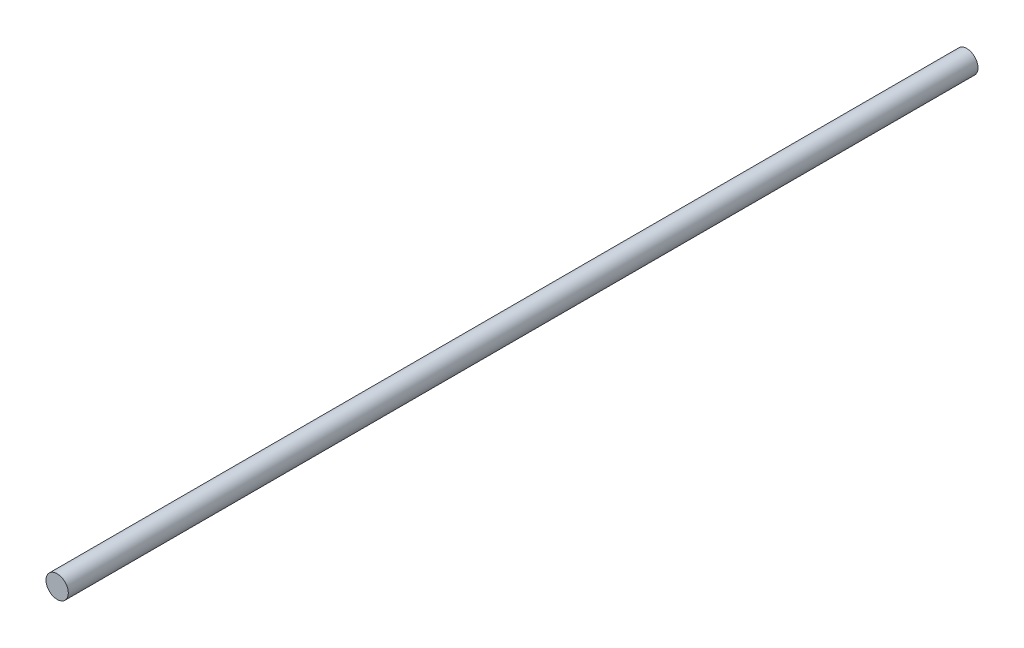
ISO-10303-21;
HEADER;
FILE_DESCRIPTION(('STEP AP214'),'2;1');
FILE_NAME('part.step','',(''),(''),'','','');
FILE_SCHEMA(('AUTOMOTIVE_DESIGN { 1 0 10303 214 1 1 1 1 }'));
ENDSEC;
DATA;
#1=APPLICATION_CONTEXT('core data for automotive mechanical design processes');
#2=APPLICATION_PROTOCOL_DEFINITION('international standard','automotive_design',2000,#1);
#3=PRODUCT_CONTEXT('',#1,'mechanical');
#4=PRODUCT('Part','Part','',(#3));
#5=PRODUCT_RELATED_PRODUCT_CATEGORY('part','',(#4));
#6=PRODUCT_DEFINITION_FORMATION('','',#4);
#7=PRODUCT_DEFINITION_CONTEXT('part definition',#1,'design');
#8=PRODUCT_DEFINITION('design','',#6,#7);
#9=PRODUCT_DEFINITION_SHAPE('','',#8);
#10=(LENGTH_UNIT() NAMED_UNIT(*) SI_UNIT(.MILLI.,.METRE.));
#11=(NAMED_UNIT(*) PLANE_ANGLE_UNIT() SI_UNIT($,.RADIAN.));
#12=(NAMED_UNIT(*) SI_UNIT($,.STERADIAN.) SOLID_ANGLE_UNIT());
#13=UNCERTAINTY_MEASURE_WITH_UNIT(LENGTH_MEASURE(1.E-05),#10,'distance_accuracy_value','');
#14=(GEOMETRIC_REPRESENTATION_CONTEXT(3) GLOBAL_UNCERTAINTY_ASSIGNED_CONTEXT((#13)) GLOBAL_UNIT_ASSIGNED_CONTEXT((#10,
#11,#12)) REPRESENTATION_CONTEXT('',''));
#15=CARTESIAN_POINT('',(0.,0.,0.));
#16=DIRECTION('',(0.,0.,1.));
#17=DIRECTION('',(1.,0.,0.));
#18=AXIS2_PLACEMENT_3D('',#15,#16,#17);
#19=CARTESIAN_POINT('',(0.,0.,7.8));
#20=DIRECTION('',(0.,0.,-1.));
#21=DIRECTION('',(-1.,0.,0.));
#22=AXIS2_PLACEMENT_3D('',#19,#20,#21);
#23=PLANE('',#22);
#24=CARTESIAN_POINT('',(0.,0.,7.8));
#25=DIRECTION('',(0.,0.,1.));
#26=DIRECTION('',(1.,0.,0.));
#27=AXIS2_PLACEMENT_3D('',#24,#25,#26);
#28=CIRCLE('',#27,4.);
#29=CARTESIAN_POINT('',(4.,0.,7.8));
#30=VERTEX_POINT('',#29);
#31=EDGE_CURVE('E10',#30,#30,#28,.T.);
#32=ORIENTED_EDGE('',*,*,#31,.T.);
#33=EDGE_LOOP('',(#32));
#34=FACE_BOUND('',#33,.T.);
#35=ADVANCED_FACE('F32',(#34),#23,.F.);
#36=CARTESIAN_POINT('',(0.,0.,7.8));
#37=DIRECTION('',(0.,0.,1.));
#38=DIRECTION('',(1.,0.,0.));
#39=AXIS2_PLACEMENT_3D('',#36,#37,#38);
#40=CYLINDRICAL_SURFACE('',#39,4.);
#41=ORIENTED_EDGE('',*,*,#31,.F.);
#42=EDGE_LOOP('',(#41));
#43=FACE_BOUND('',#42,.T.);
#44=CARTESIAN_POINT('',(0.,0.,-318.047675392386));
#45=DIRECTION('',(0.,0.,1.));
#46=DIRECTION('',(1.,0.,0.));
#47=AXIS2_PLACEMENT_3D('',#44,#45,#46);
#48=CIRCLE('',#47,4.);
#49=CARTESIAN_POINT('',(4.,0.,-318.047675392386));
#50=VERTEX_POINT('',#49);
#51=EDGE_CURVE('E38',#50,#50,#48,.T.);
#52=ORIENTED_EDGE('',*,*,#51,.T.);
#53=EDGE_LOOP('',(#52));
#54=FACE_BOUND('',#53,.T.);
#55=ADVANCED_FACE('F44',(#43,#54),#40,.T.);
#56=CARTESIAN_POINT('',(0.,0.,-318.047675392386));
#57=DIRECTION('',(0.,0.,1.));
#58=DIRECTION('',(1.,0.,0.));
#59=AXIS2_PLACEMENT_3D('',#56,#57,#58);
#60=PLANE('',#59);
#61=ORIENTED_EDGE('',*,*,#51,.F.);
#62=EDGE_LOOP('',(#61));
#63=FACE_BOUND('',#62,.T.);
#64=ADVANCED_FACE('F46',(#63),#60,.F.);
#65=CLOSED_SHELL('',(#35,#55,#64));
#66=MANIFOLD_SOLID_BREP('B2',#65);
#67=ADVANCED_BREP_SHAPE_REPRESENTATION('',(#18,#66),#14);
#68=SHAPE_DEFINITION_REPRESENTATION(#9,#67);
ENDSEC;
END-ISO-10303-21;
